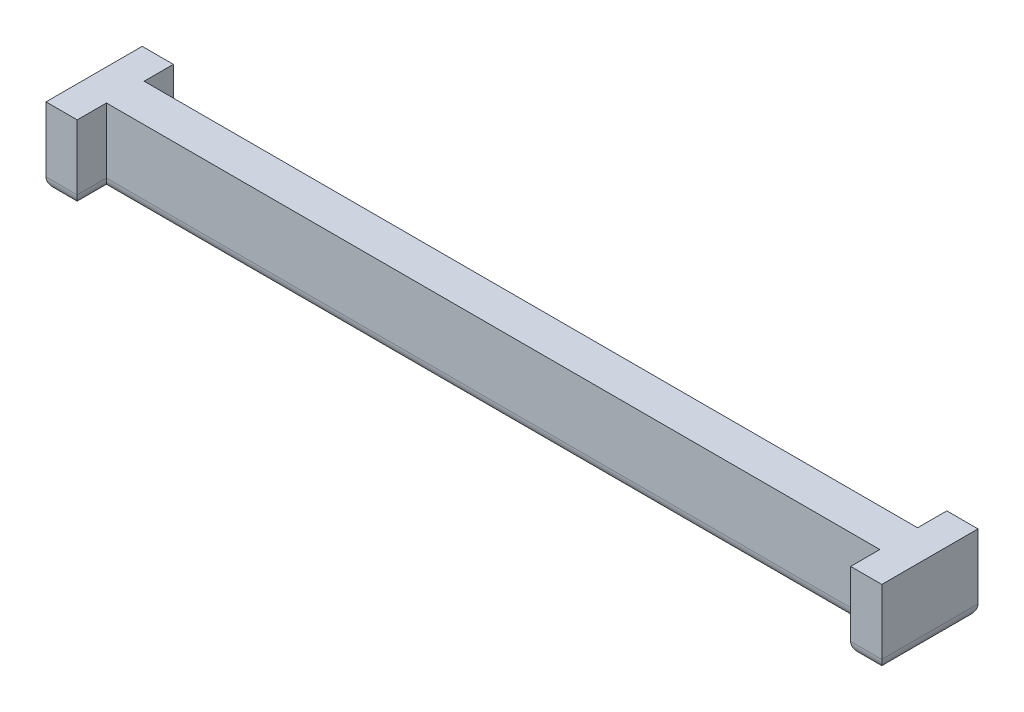
ISO-10303-21;
HEADER;
FILE_DESCRIPTION(('STEP AP214'),'2;1');
FILE_NAME('part.step','',(''),(''),'','','');
FILE_SCHEMA(('AUTOMOTIVE_DESIGN { 1 0 10303 214 1 1 1 1 }'));
ENDSEC;
DATA;
#1=APPLICATION_CONTEXT('core data for automotive mechanical design processes');
#2=APPLICATION_PROTOCOL_DEFINITION('international standard','automotive_design',2000,#1);
#3=PRODUCT_CONTEXT('',#1,'mechanical');
#4=PRODUCT('Part','Part','',(#3));
#5=PRODUCT_RELATED_PRODUCT_CATEGORY('part','',(#4));
#6=PRODUCT_DEFINITION_FORMATION('','',#4);
#7=PRODUCT_DEFINITION_CONTEXT('part definition',#1,'design');
#8=PRODUCT_DEFINITION('design','',#6,#7);
#9=PRODUCT_DEFINITION_SHAPE('','',#8);
#10=(LENGTH_UNIT() NAMED_UNIT(*) SI_UNIT(.MILLI.,.METRE.));
#11=(NAMED_UNIT(*) PLANE_ANGLE_UNIT() SI_UNIT($,.RADIAN.));
#12=(NAMED_UNIT(*) SI_UNIT($,.STERADIAN.) SOLID_ANGLE_UNIT());
#13=UNCERTAINTY_MEASURE_WITH_UNIT(LENGTH_MEASURE(1.E-05),#10,'distance_accuracy_value','');
#14=(GEOMETRIC_REPRESENTATION_CONTEXT(3) GLOBAL_UNCERTAINTY_ASSIGNED_CONTEXT((#13)) GLOBAL_UNIT_ASSIGNED_CONTEXT((#10,
#11,#12)) REPRESENTATION_CONTEXT('',''));
#15=CARTESIAN_POINT('',(0.,0.,0.));
#16=DIRECTION('',(0.,0.,1.));
#17=DIRECTION('',(1.,0.,0.));
#18=AXIS2_PLACEMENT_3D('',#15,#16,#17);
#19=CARTESIAN_POINT('',(-29.75,6.,-5.15));
#20=DIRECTION('',(-1.,0.,0.));
#21=DIRECTION('',(0.,0.,1.));
#22=AXIS2_PLACEMENT_3D('',#19,#20,#21);
#23=PLANE('',#22);
#24=DIRECTION('',(0.,-1.,0.));
#25=VECTOR('',#24,1.);
#26=CARTESIAN_POINT('',(-29.75,6.,-2.9));
#27=LINE('',#26,#25);
#28=CARTESIAN_POINT('',(-29.75,6.,-2.9));
#29=VERTEX_POINT('',#28);
#30=CARTESIAN_POINT('',(-29.75,1.,-2.9));
#31=VERTEX_POINT('',#30);
#32=EDGE_CURVE('E330',#29,#31,#27,.T.);
#33=ORIENTED_EDGE('',*,*,#32,.T.);
#34=DIRECTION('',(0.,0.,-1.));
#35=VECTOR('',#34,1.);
#36=CARTESIAN_POINT('',(-29.75,1.,-5.15));
#37=LINE('',#36,#35);
#38=CARTESIAN_POINT('',(-29.75,1.,-5.15));
#39=VERTEX_POINT('',#38);
#40=EDGE_CURVE('E11',#31,#39,#37,.T.);
#41=ORIENTED_EDGE('',*,*,#40,.T.);
#42=DIRECTION('',(0.,-1.,0.));
#43=VECTOR('',#42,1.);
#44=CARTESIAN_POINT('',(-29.75,6.,-5.15));
#45=LINE('',#44,#43);
#46=CARTESIAN_POINT('',(-29.75,6.,-5.15));
#47=VERTEX_POINT('',#46);
#48=EDGE_CURVE('E172',#47,#39,#45,.T.);
#49=ORIENTED_EDGE('',*,*,#48,.F.);
#50=DIRECTION('',(0.,0.,-1.));
#51=VECTOR('',#50,1.);
#52=CARTESIAN_POINT('',(-29.75,6.,-5.15));
#53=LINE('',#52,#51);
#54=EDGE_CURVE('E179',#29,#47,#53,.T.);
#55=ORIENTED_EDGE('',*,*,#54,.F.);
#56=EDGE_LOOP('',(#33,#41,#49,#55));
#57=FACE_BOUND('',#56,.T.);
#58=ADVANCED_FACE('F39',(#57),#23,.F.);
#59=CARTESIAN_POINT('',(-32.15,6.,-5.15));
#60=DIRECTION('',(0.,0.,1.));
#61=DIRECTION('',(1.,0.,0.));
#62=AXIS2_PLACEMENT_3D('',#59,#60,#61);
#63=PLANE('',#62);
#64=ORIENTED_EDGE('',*,*,#48,.T.);
#65=DIRECTION('',(-1.,0.,0.));
#66=VECTOR('',#65,1.);
#67=CARTESIAN_POINT('',(-32.15,1.,-5.15));
#68=LINE('',#67,#66);
#69=CARTESIAN_POINT('',(-32.15,1.,-5.15));
#70=VERTEX_POINT('',#69);
#71=EDGE_CURVE('E188',#39,#70,#68,.T.);
#72=ORIENTED_EDGE('',*,*,#71,.T.);
#73=DIRECTION('',(0.,-1.,0.));
#74=VECTOR('',#73,1.);
#75=CARTESIAN_POINT('',(-32.15,6.,-5.15));
#76=LINE('',#75,#74);
#77=CARTESIAN_POINT('',(-32.15,6.,-5.15));
#78=VERTEX_POINT('',#77);
#79=EDGE_CURVE('E175',#78,#70,#76,.T.);
#80=ORIENTED_EDGE('',*,*,#79,.F.);
#81=DIRECTION('',(-1.,0.,0.));
#82=VECTOR('',#81,1.);
#83=CARTESIAN_POINT('',(-32.15,6.,-5.15));
#84=LINE('',#83,#82);
#85=EDGE_CURVE('E167',#47,#78,#84,.T.);
#86=ORIENTED_EDGE('',*,*,#85,.F.);
#87=EDGE_LOOP('',(#64,#72,#80,#86));
#88=FACE_BOUND('',#87,.T.);
#89=ADVANCED_FACE('F169',(#88),#63,.F.);
#90=CARTESIAN_POINT('',(-32.15,6.,2.25));
#91=DIRECTION('',(1.,0.,0.));
#92=DIRECTION('',(0.,0.,-1.));
#93=AXIS2_PLACEMENT_3D('',#90,#91,#92);
#94=PLANE('',#93);
#95=ORIENTED_EDGE('',*,*,#79,.T.);
#96=DIRECTION('',(0.,0.,1.));
#97=VECTOR('',#96,1.);
#98=CARTESIAN_POINT('',(-32.15,1.,2.25));
#99=LINE('',#98,#97);
#100=CARTESIAN_POINT('',(-32.15,1.,2.25));
#101=VERTEX_POINT('',#100);
#102=EDGE_CURVE('E220',#70,#101,#99,.T.);
#103=ORIENTED_EDGE('',*,*,#102,.T.);
#104=DIRECTION('',(0.,-1.,0.));
#105=VECTOR('',#104,1.);
#106=CARTESIAN_POINT('',(-32.15,6.,2.25));
#107=LINE('',#106,#105);
#108=CARTESIAN_POINT('',(-32.15,6.,2.25));
#109=VERTEX_POINT('',#108);
#110=EDGE_CURVE('E192',#109,#101,#107,.T.);
#111=ORIENTED_EDGE('',*,*,#110,.F.);
#112=DIRECTION('',(0.,0.,1.));
#113=VECTOR('',#112,1.);
#114=CARTESIAN_POINT('',(-32.15,6.,2.25));
#115=LINE('',#114,#113);
#116=EDGE_CURVE('E178',#78,#109,#115,.T.);
#117=ORIENTED_EDGE('',*,*,#116,.F.);
#118=EDGE_LOOP('',(#95,#103,#111,#117));
#119=FACE_BOUND('',#118,.T.);
#120=ADVANCED_FACE('F307',(#119),#94,.F.);
#121=CARTESIAN_POINT('',(-29.75,6.,2.25));
#122=DIRECTION('',(0.,0.,-1.));
#123=DIRECTION('',(-1.,0.,0.));
#124=AXIS2_PLACEMENT_3D('',#121,#122,#123);
#125=PLANE('',#124);
#126=ORIENTED_EDGE('',*,*,#110,.T.);
#127=DIRECTION('',(1.,0.,0.));
#128=VECTOR('',#127,1.);
#129=CARTESIAN_POINT('',(-29.75,1.,2.25));
#130=LINE('',#129,#128);
#131=CARTESIAN_POINT('',(-29.75,1.,2.25));
#132=VERTEX_POINT('',#131);
#133=EDGE_CURVE('E222',#101,#132,#130,.T.);
#134=ORIENTED_EDGE('',*,*,#133,.T.);
#135=DIRECTION('',(0.,-1.,0.));
#136=VECTOR('',#135,1.);
#137=CARTESIAN_POINT('',(-29.75,6.,2.25));
#138=LINE('',#137,#136);
#139=CARTESIAN_POINT('',(-29.75,6.,2.25));
#140=VERTEX_POINT('',#139);
#141=EDGE_CURVE('E351',#140,#132,#138,.T.);
#142=ORIENTED_EDGE('',*,*,#141,.F.);
#143=DIRECTION('',(1.,0.,0.));
#144=VECTOR('',#143,1.);
#145=CARTESIAN_POINT('',(-29.75,6.,2.25));
#146=LINE('',#145,#144);
#147=EDGE_CURVE('E311',#109,#140,#146,.T.);
#148=ORIENTED_EDGE('',*,*,#147,.F.);
#149=EDGE_LOOP('',(#126,#134,#142,#148));
#150=FACE_BOUND('',#149,.T.);
#151=ADVANCED_FACE('F355',(#150),#125,.F.);
#152=CARTESIAN_POINT('',(-29.75,6.,0.));
#153=DIRECTION('',(-1.,0.,0.));
#154=DIRECTION('',(0.,0.,1.));
#155=AXIS2_PLACEMENT_3D('',#152,#153,#154);
#156=PLANE('',#155);
#157=ORIENTED_EDGE('',*,*,#141,.T.);
#158=DIRECTION('',(0.,0.,-1.));
#159=VECTOR('',#158,1.);
#160=CARTESIAN_POINT('',(-29.75,1.,0.));
#161=LINE('',#160,#159);
#162=CARTESIAN_POINT('',(-29.75,1.,0.));
#163=VERTEX_POINT('',#162);
#164=EDGE_CURVE('E224',#132,#163,#161,.T.);
#165=ORIENTED_EDGE('',*,*,#164,.T.);
#166=DIRECTION('',(0.,-1.,0.));
#167=VECTOR('',#166,1.);
#168=CARTESIAN_POINT('',(-29.75,6.,0.));
#169=LINE('',#168,#167);
#170=CARTESIAN_POINT('',(-29.75,6.,0.));
#171=VERTEX_POINT('',#170);
#172=EDGE_CURVE('E348',#171,#163,#169,.T.);
#173=ORIENTED_EDGE('',*,*,#172,.F.);
#174=DIRECTION('',(0.,0.,-1.));
#175=VECTOR('',#174,1.);
#176=CARTESIAN_POINT('',(-29.75,6.,0.));
#177=LINE('',#176,#175);
#178=EDGE_CURVE('E313',#140,#171,#177,.T.);
#179=ORIENTED_EDGE('',*,*,#178,.F.);
#180=EDGE_LOOP('',(#157,#165,#173,#179));
#181=FACE_BOUND('',#180,.T.);
#182=ADVANCED_FACE('F373',(#181),#156,.F.);
#183=CARTESIAN_POINT('',(29.75,6.,0.));
#184=DIRECTION('',(0.,0.,-1.));
#185=DIRECTION('',(-1.,0.,0.));
#186=AXIS2_PLACEMENT_3D('',#183,#184,#185);
#187=PLANE('',#186);
#188=ORIENTED_EDGE('',*,*,#172,.T.);
#189=DIRECTION('',(1.,0.,0.));
#190=VECTOR('',#189,1.);
#191=CARTESIAN_POINT('',(29.75,1.,0.));
#192=LINE('',#191,#190);
#193=CARTESIAN_POINT('',(29.75,1.,0.));
#194=VERTEX_POINT('',#193);
#195=EDGE_CURVE('E226',#163,#194,#192,.T.);
#196=ORIENTED_EDGE('',*,*,#195,.T.);
#197=DIRECTION('',(0.,-1.,0.));
#198=VECTOR('',#197,1.);
#199=CARTESIAN_POINT('',(29.75,6.,0.));
#200=LINE('',#199,#198);
#201=CARTESIAN_POINT('',(29.75,6.,0.));
#202=VERTEX_POINT('',#201);
#203=EDGE_CURVE('E345',#202,#194,#200,.T.);
#204=ORIENTED_EDGE('',*,*,#203,.F.);
#205=DIRECTION('',(1.,0.,0.));
#206=VECTOR('',#205,1.);
#207=CARTESIAN_POINT('',(29.75,6.,0.));
#208=LINE('',#207,#206);
#209=EDGE_CURVE('E317',#171,#202,#208,.T.);
#210=ORIENTED_EDGE('',*,*,#209,.F.);
#211=EDGE_LOOP('',(#188,#196,#204,#210));
#212=FACE_BOUND('',#211,.T.);
#213=ADVANCED_FACE('F378',(#212),#187,.F.);
#214=CARTESIAN_POINT('',(29.75,6.,2.25));
#215=DIRECTION('',(1.,0.,0.));
#216=DIRECTION('',(0.,0.,-1.));
#217=AXIS2_PLACEMENT_3D('',#214,#215,#216);
#218=PLANE('',#217);
#219=ORIENTED_EDGE('',*,*,#203,.T.);
#220=DIRECTION('',(0.,0.,1.));
#221=VECTOR('',#220,1.);
#222=CARTESIAN_POINT('',(29.75,1.,2.25));
#223=LINE('',#222,#221);
#224=CARTESIAN_POINT('',(29.75,1.,2.25));
#225=VERTEX_POINT('',#224);
#226=EDGE_CURVE('E228',#194,#225,#223,.T.);
#227=ORIENTED_EDGE('',*,*,#226,.T.);
#228=DIRECTION('',(0.,-1.,0.));
#229=VECTOR('',#228,1.);
#230=CARTESIAN_POINT('',(29.75,6.,2.25));
#231=LINE('',#230,#229);
#232=CARTESIAN_POINT('',(29.75,6.,2.25));
#233=VERTEX_POINT('',#232);
#234=EDGE_CURVE('E342',#233,#225,#231,.T.);
#235=ORIENTED_EDGE('',*,*,#234,.F.);
#236=DIRECTION('',(0.,0.,1.));
#237=VECTOR('',#236,1.);
#238=CARTESIAN_POINT('',(29.75,6.,2.25));
#239=LINE('',#238,#237);
#240=EDGE_CURVE('E319',#202,#233,#239,.T.);
#241=ORIENTED_EDGE('',*,*,#240,.F.);
#242=EDGE_LOOP('',(#219,#227,#235,#241));
#243=FACE_BOUND('',#242,.T.);
#244=ADVANCED_FACE('F385',(#243),#218,.F.);
#245=CARTESIAN_POINT('',(32.15,6.,2.25));
#246=DIRECTION('',(0.,0.,-1.));
#247=DIRECTION('',(-1.,0.,0.));
#248=AXIS2_PLACEMENT_3D('',#245,#246,#247);
#249=PLANE('',#248);
#250=ORIENTED_EDGE('',*,*,#234,.T.);
#251=DIRECTION('',(1.,0.,0.));
#252=VECTOR('',#251,1.);
#253=CARTESIAN_POINT('',(32.15,1.,2.25));
#254=LINE('',#253,#252);
#255=CARTESIAN_POINT('',(32.15,1.,2.25));
#256=VERTEX_POINT('',#255);
#257=EDGE_CURVE('E230',#225,#256,#254,.T.);
#258=ORIENTED_EDGE('',*,*,#257,.T.);
#259=DIRECTION('',(0.,-1.,0.));
#260=VECTOR('',#259,1.);
#261=CARTESIAN_POINT('',(32.15,6.,2.25));
#262=LINE('',#261,#260);
#263=CARTESIAN_POINT('',(32.15,6.,2.25));
#264=VERTEX_POINT('',#263);
#265=EDGE_CURVE('E339',#264,#256,#262,.T.);
#266=ORIENTED_EDGE('',*,*,#265,.F.);
#267=DIRECTION('',(1.,0.,0.));
#268=VECTOR('',#267,1.);
#269=CARTESIAN_POINT('',(32.15,6.,2.25));
#270=LINE('',#269,#268);
#271=EDGE_CURVE('E321',#233,#264,#270,.T.);
#272=ORIENTED_EDGE('',*,*,#271,.F.);
#273=EDGE_LOOP('',(#250,#258,#266,#272));
#274=FACE_BOUND('',#273,.T.);
#275=ADVANCED_FACE('F389',(#274),#249,.F.);
#276=CARTESIAN_POINT('',(32.15,6.,-5.15));
#277=DIRECTION('',(-1.,0.,0.));
#278=DIRECTION('',(0.,0.,1.));
#279=AXIS2_PLACEMENT_3D('',#276,#277,#278);
#280=PLANE('',#279);
#281=ORIENTED_EDGE('',*,*,#265,.T.);
#282=DIRECTION('',(0.,0.,-1.));
#283=VECTOR('',#282,1.);
#284=CARTESIAN_POINT('',(32.15,1.,-5.15));
#285=LINE('',#284,#283);
#286=CARTESIAN_POINT('',(32.15,1.,-5.15));
#287=VERTEX_POINT('',#286);
#288=EDGE_CURVE('E232',#256,#287,#285,.T.);
#289=ORIENTED_EDGE('',*,*,#288,.T.);
#290=DIRECTION('',(0.,-1.,0.));
#291=VECTOR('',#290,1.);
#292=CARTESIAN_POINT('',(32.15,6.,-5.15));
#293=LINE('',#292,#291);
#294=CARTESIAN_POINT('',(32.15,6.,-5.15));
#295=VERTEX_POINT('',#294);
#296=EDGE_CURVE('E336',#295,#287,#293,.T.);
#297=ORIENTED_EDGE('',*,*,#296,.F.);
#298=DIRECTION('',(0.,0.,-1.));
#299=VECTOR('',#298,1.);
#300=CARTESIAN_POINT('',(32.15,6.,-5.15));
#301=LINE('',#300,#299);
#302=EDGE_CURVE('E323',#264,#295,#301,.T.);
#303=ORIENTED_EDGE('',*,*,#302,.F.);
#304=EDGE_LOOP('',(#281,#289,#297,#303));
#305=FACE_BOUND('',#304,.T.);
#306=ADVANCED_FACE('F396',(#305),#280,.F.);
#307=CARTESIAN_POINT('',(29.75,6.,-5.15));
#308=DIRECTION('',(0.,0.,1.));
#309=DIRECTION('',(1.,0.,0.));
#310=AXIS2_PLACEMENT_3D('',#307,#308,#309);
#311=PLANE('',#310);
#312=ORIENTED_EDGE('',*,*,#296,.T.);
#313=DIRECTION('',(-1.,0.,0.));
#314=VECTOR('',#313,1.);
#315=CARTESIAN_POINT('',(29.75,1.,-5.15));
#316=LINE('',#315,#314);
#317=CARTESIAN_POINT('',(29.75,1.,-5.15));
#318=VERTEX_POINT('',#317);
#319=EDGE_CURVE('E234',#287,#318,#316,.T.);
#320=ORIENTED_EDGE('',*,*,#319,.T.);
#321=DIRECTION('',(0.,-1.,0.));
#322=VECTOR('',#321,1.);
#323=CARTESIAN_POINT('',(29.75,6.,-5.15));
#324=LINE('',#323,#322);
#325=CARTESIAN_POINT('',(29.75,6.,-5.15));
#326=VERTEX_POINT('',#325);
#327=EDGE_CURVE('E334',#326,#318,#324,.T.);
#328=ORIENTED_EDGE('',*,*,#327,.F.);
#329=DIRECTION('',(-1.,0.,0.));
#330=VECTOR('',#329,1.);
#331=CARTESIAN_POINT('',(29.75,6.,-5.15));
#332=LINE('',#331,#330);
#333=EDGE_CURVE('E325',#295,#326,#332,.T.);
#334=ORIENTED_EDGE('',*,*,#333,.F.);
#335=EDGE_LOOP('',(#312,#320,#328,#334));
#336=FACE_BOUND('',#335,.T.);
#337=ADVANCED_FACE('F398',(#336),#311,.F.);
#338=CARTESIAN_POINT('',(29.75,6.,-2.9));
#339=DIRECTION('',(1.,0.,0.));
#340=DIRECTION('',(0.,0.,-1.));
#341=AXIS2_PLACEMENT_3D('',#338,#339,#340);
#342=PLANE('',#341);
#343=ORIENTED_EDGE('',*,*,#327,.T.);
#344=DIRECTION('',(0.,0.,1.));
#345=VECTOR('',#344,1.);
#346=CARTESIAN_POINT('',(29.75,1.,-2.9));
#347=LINE('',#346,#345);
#348=CARTESIAN_POINT('',(29.75,1.,-2.9));
#349=VERTEX_POINT('',#348);
#350=EDGE_CURVE('E63',#318,#349,#347,.T.);
#351=ORIENTED_EDGE('',*,*,#350,.T.);
#352=DIRECTION('',(0.,-1.,0.));
#353=VECTOR('',#352,1.);
#354=CARTESIAN_POINT('',(29.75,6.,-2.9));
#355=LINE('',#354,#353);
#356=CARTESIAN_POINT('',(29.75,6.,-2.9));
#357=VERTEX_POINT('',#356);
#358=EDGE_CURVE('E332',#357,#349,#355,.T.);
#359=ORIENTED_EDGE('',*,*,#358,.F.);
#360=DIRECTION('',(0.,0.,1.));
#361=VECTOR('',#360,1.);
#362=CARTESIAN_POINT('',(29.75,6.,-2.9));
#363=LINE('',#362,#361);
#364=EDGE_CURVE('E327',#326,#357,#363,.T.);
#365=ORIENTED_EDGE('',*,*,#364,.F.);
#366=EDGE_LOOP('',(#343,#351,#359,#365));
#367=FACE_BOUND('',#366,.T.);
#368=ADVANCED_FACE('F400',(#367),#342,.F.);
#369=CARTESIAN_POINT('',(-29.75,6.,-2.9));
#370=DIRECTION('',(0.,0.,1.));
#371=DIRECTION('',(1.,0.,0.));
#372=AXIS2_PLACEMENT_3D('',#369,#370,#371);
#373=PLANE('',#372);
#374=ORIENTED_EDGE('',*,*,#358,.T.);
#375=DIRECTION('',(-1.,0.,0.));
#376=VECTOR('',#375,1.);
#377=CARTESIAN_POINT('',(-29.75,1.,-2.9));
#378=LINE('',#377,#376);
#379=EDGE_CURVE('E48',#349,#31,#378,.T.);
#380=ORIENTED_EDGE('',*,*,#379,.T.);
#381=ORIENTED_EDGE('',*,*,#32,.F.);
#382=DIRECTION('',(-1.,0.,0.));
#383=VECTOR('',#382,1.);
#384=CARTESIAN_POINT('',(-29.75,6.,-2.9));
#385=LINE('',#384,#383);
#386=EDGE_CURVE('E184',#357,#29,#385,.T.);
#387=ORIENTED_EDGE('',*,*,#386,.F.);
#388=EDGE_LOOP('',(#374,#380,#381,#387));
#389=FACE_BOUND('',#388,.T.);
#390=ADVANCED_FACE('F401',(#389),#373,.F.);
#391=CARTESIAN_POINT('',(0.,6.,0.));
#392=DIRECTION('',(0.,1.,0.));
#393=DIRECTION('',(0.,0.,1.));
#394=AXIS2_PLACEMENT_3D('',#391,#392,#393);
#395=PLANE('',#394);
#396=ORIENTED_EDGE('',*,*,#54,.T.);
#397=ORIENTED_EDGE('',*,*,#85,.T.);
#398=ORIENTED_EDGE('',*,*,#116,.T.);
#399=ORIENTED_EDGE('',*,*,#147,.T.);
#400=ORIENTED_EDGE('',*,*,#178,.T.);
#401=ORIENTED_EDGE('',*,*,#209,.T.);
#402=ORIENTED_EDGE('',*,*,#240,.T.);
#403=ORIENTED_EDGE('',*,*,#271,.T.);
#404=ORIENTED_EDGE('',*,*,#302,.T.);
#405=ORIENTED_EDGE('',*,*,#333,.T.);
#406=ORIENTED_EDGE('',*,*,#364,.T.);
#407=ORIENTED_EDGE('',*,*,#386,.T.);
#408=EDGE_LOOP('',(#396,#397,#398,#399,#400,#401,#402,#403,#404,#405,#406,#407));
#409=FACE_BOUND('',#408,.T.);
#410=ADVANCED_FACE('F182',(#409),#395,.T.);
#411=CARTESIAN_POINT('',(0.,0.,0.));
#412=DIRECTION('',(0.,1.,0.));
#413=DIRECTION('',(0.,0.,1.));
#414=AXIS2_PLACEMENT_3D('',#411,#412,#413);
#415=PLANE('',#414);
#416=DIRECTION('',(0.,0.,1.));
#417=VECTOR('',#416,1.);
#418=CARTESIAN_POINT('',(-31.15,0.,0.));
#419=LINE('',#418,#417);
#420=CARTESIAN_POINT('',(-31.15,0.,1.25));
#421=VERTEX_POINT('',#420);
#422=CARTESIAN_POINT('',(-31.15,0.,-4.15));
#423=VERTEX_POINT('',#422);
#424=EDGE_CURVE('E215',#421,#423,#419,.F.);
#425=ORIENTED_EDGE('',*,*,#424,.T.);
#426=DIRECTION('',(-1.,0.,0.));
#427=VECTOR('',#426,1.);
#428=CARTESIAN_POINT('',(0.,0.,-4.15));
#429=LINE('',#428,#427);
#430=CARTESIAN_POINT('',(-30.75,0.,-4.15));
#431=VERTEX_POINT('',#430);
#432=EDGE_CURVE('E217',#423,#431,#429,.F.);
#433=ORIENTED_EDGE('',*,*,#432,.T.);
#434=DIRECTION('',(0.,0.,-1.));
#435=VECTOR('',#434,1.);
#436=CARTESIAN_POINT('',(-30.75,0.,0.));
#437=LINE('',#436,#435);
#438=CARTESIAN_POINT('',(-30.75,0.,-1.9));
#439=VERTEX_POINT('',#438);
#440=EDGE_CURVE('E190',#431,#439,#437,.F.);
#441=ORIENTED_EDGE('',*,*,#440,.T.);
#442=DIRECTION('',(-1.,0.,0.));
#443=VECTOR('',#442,1.);
#444=CARTESIAN_POINT('',(0.,0.,-1.9));
#445=LINE('',#444,#443);
#446=CARTESIAN_POINT('',(30.75,0.,-1.9));
#447=VERTEX_POINT('',#446);
#448=EDGE_CURVE('E197',#439,#447,#445,.F.);
#449=ORIENTED_EDGE('',*,*,#448,.T.);
#450=DIRECTION('',(0.,0.,1.));
#451=VECTOR('',#450,1.);
#452=CARTESIAN_POINT('',(30.75,0.,0.));
#453=LINE('',#452,#451);
#454=CARTESIAN_POINT('',(30.75,0.,-4.15));
#455=VERTEX_POINT('',#454);
#456=EDGE_CURVE('E199',#447,#455,#453,.F.);
#457=ORIENTED_EDGE('',*,*,#456,.T.);
#458=DIRECTION('',(-1.,0.,0.));
#459=VECTOR('',#458,1.);
#460=CARTESIAN_POINT('',(0.,0.,-4.15));
#461=LINE('',#460,#459);
#462=CARTESIAN_POINT('',(31.15,0.,-4.15));
#463=VERTEX_POINT('',#462);
#464=EDGE_CURVE('E201',#455,#463,#461,.F.);
#465=ORIENTED_EDGE('',*,*,#464,.T.);
#466=DIRECTION('',(0.,0.,-1.));
#467=VECTOR('',#466,1.);
#468=CARTESIAN_POINT('',(31.15,0.,0.));
#469=LINE('',#468,#467);
#470=CARTESIAN_POINT('',(31.15,0.,1.25));
#471=VERTEX_POINT('',#470);
#472=EDGE_CURVE('E203',#463,#471,#469,.F.);
#473=ORIENTED_EDGE('',*,*,#472,.T.);
#474=DIRECTION('',(1.,0.,0.));
#475=VECTOR('',#474,1.);
#476=CARTESIAN_POINT('',(0.,0.,1.25));
#477=LINE('',#476,#475);
#478=CARTESIAN_POINT('',(30.75,0.,1.25));
#479=VERTEX_POINT('',#478);
#480=EDGE_CURVE('E205',#471,#479,#477,.F.);
#481=ORIENTED_EDGE('',*,*,#480,.T.);
#482=DIRECTION('',(0.,0.,1.));
#483=VECTOR('',#482,1.);
#484=CARTESIAN_POINT('',(30.75,0.,0.));
#485=LINE('',#484,#483);
#486=CARTESIAN_POINT('',(30.75,0.,-1.));
#487=VERTEX_POINT('',#486);
#488=EDGE_CURVE('E207',#479,#487,#485,.F.);
#489=ORIENTED_EDGE('',*,*,#488,.T.);
#490=DIRECTION('',(1.,0.,0.));
#491=VECTOR('',#490,1.);
#492=CARTESIAN_POINT('',(0.,0.,-1.));
#493=LINE('',#492,#491);
#494=CARTESIAN_POINT('',(-30.75,0.,-1.));
#495=VERTEX_POINT('',#494);
#496=EDGE_CURVE('E209',#487,#495,#493,.F.);
#497=ORIENTED_EDGE('',*,*,#496,.T.);
#498=DIRECTION('',(0.,0.,-1.));
#499=VECTOR('',#498,1.);
#500=CARTESIAN_POINT('',(-30.75,0.,0.));
#501=LINE('',#500,#499);
#502=CARTESIAN_POINT('',(-30.75,0.,1.25));
#503=VERTEX_POINT('',#502);
#504=EDGE_CURVE('E211',#495,#503,#501,.F.);
#505=ORIENTED_EDGE('',*,*,#504,.T.);
#506=DIRECTION('',(1.,0.,0.));
#507=VECTOR('',#506,1.);
#508=CARTESIAN_POINT('',(0.,0.,1.25));
#509=LINE('',#508,#507);
#510=EDGE_CURVE('E213',#503,#421,#509,.F.);
#511=ORIENTED_EDGE('',*,*,#510,.T.);
#512=EDGE_LOOP('',(#425,#433,#441,#449,#457,#465,#473,#481,#489,#497,#505,#511));
#513=FACE_BOUND('',#512,.T.);
#514=ADVANCED_FACE('F282',(#513),#415,.F.);
#515=CARTESIAN_POINT('',(32.15,1.,1.25));
#516=DIRECTION('',(1.,0.,0.));
#517=DIRECTION('',(0.,0.,-1.));
#518=AXIS2_PLACEMENT_3D('',#515,#516,#517);
#519=CYLINDRICAL_SURFACE('',#518,1.);
#520=CARTESIAN_POINT('',(30.75,1.,1.25));
#521=DIRECTION('',(0.707106781186547,0.,0.707106781186547));
#522=DIRECTION('',(0.707106781186547,0.,-0.707106781186547));
#523=AXIS2_PLACEMENT_3D('',#520,#521,#522);
#524=ELLIPSE('',#523,1.41421356237309,1.);
#525=EDGE_CURVE('E265',#479,#225,#524,.F.);
#526=ORIENTED_EDGE('',*,*,#525,.F.);
#527=ORIENTED_EDGE('',*,*,#480,.F.);
#528=CARTESIAN_POINT('',(31.15,1.,1.25));
#529=DIRECTION('',(0.707106781186547,0.,-0.707106781186547));
#530=DIRECTION('',(-0.707106781186547,0.,-0.707106781186547));
#531=AXIS2_PLACEMENT_3D('',#528,#529,#530);
#532=ELLIPSE('',#531,1.41421356237309,1.);
#533=EDGE_CURVE('E43',#256,#471,#532,.T.);
#534=ORIENTED_EDGE('',*,*,#533,.F.);
#535=ORIENTED_EDGE('',*,*,#257,.F.);
#536=EDGE_LOOP('',(#526,#527,#534,#535));
#537=FACE_BOUND('',#536,.T.);
#538=ADVANCED_FACE('F41',(#537),#519,.T.);
#539=CARTESIAN_POINT('',(31.15,1.,-5.15));
#540=DIRECTION('',(0.,0.,-1.));
#541=DIRECTION('',(-1.,0.,0.));
#542=AXIS2_PLACEMENT_3D('',#539,#540,#541);
#543=CYLINDRICAL_SURFACE('',#542,1.);
#544=ORIENTED_EDGE('',*,*,#533,.T.);
#545=ORIENTED_EDGE('',*,*,#472,.F.);
#546=CARTESIAN_POINT('',(31.15,1.,-4.15));
#547=DIRECTION('',(-0.707106781186547,0.,-0.707106781186547));
#548=DIRECTION('',(-0.707106781186547,0.,0.707106781186547));
#549=AXIS2_PLACEMENT_3D('',#546,#547,#548);
#550=ELLIPSE('',#549,1.41421356237309,1.);
#551=EDGE_CURVE('E263',#287,#463,#550,.T.);
#552=ORIENTED_EDGE('',*,*,#551,.F.);
#553=ORIENTED_EDGE('',*,*,#288,.F.);
#554=EDGE_LOOP('',(#544,#545,#552,#553));
#555=FACE_BOUND('',#554,.T.);
#556=ADVANCED_FACE('F276',(#555),#543,.T.);
#557=CARTESIAN_POINT('',(30.75,1.,2.25));
#558=DIRECTION('',(0.,0.,1.));
#559=DIRECTION('',(1.,0.,0.));
#560=AXIS2_PLACEMENT_3D('',#557,#558,#559);
#561=CYLINDRICAL_SURFACE('',#560,1.);
#562=ORIENTED_EDGE('',*,*,#525,.T.);
#563=ORIENTED_EDGE('',*,*,#226,.F.);
#564=CARTESIAN_POINT('',(30.75,1.,-1.));
#565=DIRECTION('',(0.707106781186547,0.,0.707106781186547));
#566=DIRECTION('',(0.707106781186547,0.,-0.707106781186547));
#567=AXIS2_PLACEMENT_3D('',#564,#565,#566);
#568=ELLIPSE('',#567,1.41421356237309,1.);
#569=EDGE_CURVE('E260',#487,#194,#568,.F.);
#570=ORIENTED_EDGE('',*,*,#569,.F.);
#571=ORIENTED_EDGE('',*,*,#488,.F.);
#572=EDGE_LOOP('',(#562,#563,#570,#571));
#573=FACE_BOUND('',#572,.T.);
#574=ADVANCED_FACE('F382',(#573),#561,.T.);
#575=CARTESIAN_POINT('',(29.75,1.,-4.15));
#576=DIRECTION('',(-1.,0.,0.));
#577=DIRECTION('',(0.,0.,1.));
#578=AXIS2_PLACEMENT_3D('',#575,#576,#577);
#579=CYLINDRICAL_SURFACE('',#578,1.);
#580=ORIENTED_EDGE('',*,*,#551,.T.);
#581=ORIENTED_EDGE('',*,*,#464,.F.);
#582=CARTESIAN_POINT('',(30.75,1.,-4.15));
#583=DIRECTION('',(-0.707106781186547,0.,0.707106781186547));
#584=DIRECTION('',(0.707106781186547,0.,0.707106781186547));
#585=AXIS2_PLACEMENT_3D('',#582,#583,#584);
#586=ELLIPSE('',#585,1.41421356237309,1.);
#587=EDGE_CURVE('E257',#318,#455,#586,.T.);
#588=ORIENTED_EDGE('',*,*,#587,.F.);
#589=ORIENTED_EDGE('',*,*,#319,.F.);
#590=EDGE_LOOP('',(#580,#581,#588,#589));
#591=FACE_BOUND('',#590,.T.);
#592=ADVANCED_FACE('F288',(#591),#579,.T.);
#593=CARTESIAN_POINT('',(29.75,1.,-1.));
#594=DIRECTION('',(1.,0.,0.));
#595=DIRECTION('',(0.,0.,-1.));
#596=AXIS2_PLACEMENT_3D('',#593,#594,#595);
#597=CYLINDRICAL_SURFACE('',#596,1.);
#598=ORIENTED_EDGE('',*,*,#569,.T.);
#599=ORIENTED_EDGE('',*,*,#195,.F.);
#600=CARTESIAN_POINT('',(-30.75,1.,-1.));
#601=DIRECTION('',(0.707106781186547,0.,-0.707106781186547));
#602=DIRECTION('',(-0.707106781186547,0.,-0.707106781186547));
#603=AXIS2_PLACEMENT_3D('',#600,#601,#602);
#604=ELLIPSE('',#603,1.41421356237309,1.);
#605=EDGE_CURVE('E254',#495,#163,#604,.F.);
#606=ORIENTED_EDGE('',*,*,#605,.F.);
#607=ORIENTED_EDGE('',*,*,#496,.F.);
#608=EDGE_LOOP('',(#598,#599,#606,#607));
#609=FACE_BOUND('',#608,.T.);
#610=ADVANCED_FACE('F381',(#609),#597,.T.);
#611=CARTESIAN_POINT('',(30.75,1.,-2.9));
#612=DIRECTION('',(0.,0.,1.));
#613=DIRECTION('',(1.,0.,0.));
#614=AXIS2_PLACEMENT_3D('',#611,#612,#613);
#615=CYLINDRICAL_SURFACE('',#614,1.);
#616=ORIENTED_EDGE('',*,*,#587,.T.);
#617=ORIENTED_EDGE('',*,*,#456,.F.);
#618=CARTESIAN_POINT('',(30.75,1.,-1.9));
#619=DIRECTION('',(-0.707106781186547,0.,0.707106781186547));
#620=DIRECTION('',(0.707106781186547,0.,0.707106781186547));
#621=AXIS2_PLACEMENT_3D('',#618,#619,#620);
#622=ELLIPSE('',#621,1.41421356237309,1.);
#623=EDGE_CURVE('E251',#349,#447,#622,.T.);
#624=ORIENTED_EDGE('',*,*,#623,.F.);
#625=ORIENTED_EDGE('',*,*,#350,.F.);
#626=EDGE_LOOP('',(#616,#617,#624,#625));
#627=FACE_BOUND('',#626,.T.);
#628=ADVANCED_FACE('F291',(#627),#615,.T.);
#629=CARTESIAN_POINT('',(-30.75,1.,0.));
#630=DIRECTION('',(0.,0.,-1.));
#631=DIRECTION('',(-1.,0.,0.));
#632=AXIS2_PLACEMENT_3D('',#629,#630,#631);
#633=CYLINDRICAL_SURFACE('',#632,1.);
#634=ORIENTED_EDGE('',*,*,#605,.T.);
#635=ORIENTED_EDGE('',*,*,#164,.F.);
#636=CARTESIAN_POINT('',(-30.75,1.,1.25));
#637=DIRECTION('',(0.707106781186547,0.,-0.707106781186547));
#638=DIRECTION('',(-0.707106781186547,0.,-0.707106781186547));
#639=AXIS2_PLACEMENT_3D('',#636,#637,#638);
#640=ELLIPSE('',#639,1.41421356237309,1.);
#641=EDGE_CURVE('E248',#503,#132,#640,.F.);
#642=ORIENTED_EDGE('',*,*,#641,.F.);
#643=ORIENTED_EDGE('',*,*,#504,.F.);
#644=EDGE_LOOP('',(#634,#635,#642,#643));
#645=FACE_BOUND('',#644,.T.);
#646=ADVANCED_FACE('F370',(#645),#633,.T.);
#647=CARTESIAN_POINT('',(-29.75,1.,-1.9));
#648=DIRECTION('',(-1.,0.,0.));
#649=DIRECTION('',(0.,0.,1.));
#650=AXIS2_PLACEMENT_3D('',#647,#648,#649);
#651=CYLINDRICAL_SURFACE('',#650,1.);
#652=ORIENTED_EDGE('',*,*,#623,.T.);
#653=ORIENTED_EDGE('',*,*,#448,.F.);
#654=CARTESIAN_POINT('',(-30.75,1.,-1.9));
#655=DIRECTION('',(-0.707106781186547,0.,-0.707106781186547));
#656=DIRECTION('',(-0.707106781186547,0.,0.707106781186547));
#657=AXIS2_PLACEMENT_3D('',#654,#655,#656);
#658=ELLIPSE('',#657,1.41421356237309,1.);
#659=EDGE_CURVE('E245',#31,#439,#658,.T.);
#660=ORIENTED_EDGE('',*,*,#659,.F.);
#661=ORIENTED_EDGE('',*,*,#379,.F.);
#662=EDGE_LOOP('',(#652,#653,#660,#661));
#663=FACE_BOUND('',#662,.T.);
#664=ADVANCED_FACE('F296',(#663),#651,.T.);
#665=CARTESIAN_POINT('',(-29.75,1.,1.25));
#666=DIRECTION('',(1.,0.,0.));
#667=DIRECTION('',(0.,0.,-1.));
#668=AXIS2_PLACEMENT_3D('',#665,#666,#667);
#669=CYLINDRICAL_SURFACE('',#668,1.);
#670=ORIENTED_EDGE('',*,*,#641,.T.);
#671=ORIENTED_EDGE('',*,*,#133,.F.);
#672=CARTESIAN_POINT('',(-31.15,1.,1.25));
#673=DIRECTION('',(0.707106781186547,0.,0.707106781186547));
#674=DIRECTION('',(0.707106781186547,0.,-0.707106781186547));
#675=AXIS2_PLACEMENT_3D('',#672,#673,#674);
#676=ELLIPSE('',#675,1.41421356237309,1.);
#677=EDGE_CURVE('E242',#421,#101,#676,.F.);
#678=ORIENTED_EDGE('',*,*,#677,.F.);
#679=ORIENTED_EDGE('',*,*,#510,.F.);
#680=EDGE_LOOP('',(#670,#671,#678,#679));
#681=FACE_BOUND('',#680,.T.);
#682=ADVANCED_FACE('F359',(#681),#669,.T.);
#683=CARTESIAN_POINT('',(-30.75,1.,-5.15));
#684=DIRECTION('',(0.,0.,-1.));
#685=DIRECTION('',(-1.,0.,0.));
#686=AXIS2_PLACEMENT_3D('',#683,#684,#685);
#687=CYLINDRICAL_SURFACE('',#686,1.);
#688=ORIENTED_EDGE('',*,*,#659,.T.);
#689=ORIENTED_EDGE('',*,*,#440,.F.);
#690=CARTESIAN_POINT('',(-30.75,1.,-4.15));
#691=DIRECTION('',(-0.707106781186547,0.,-0.707106781186547));
#692=DIRECTION('',(0.707106781186547,0.,-0.707106781186547));
#693=AXIS2_PLACEMENT_3D('',#690,#691,#692);
#694=ELLIPSE('',#693,1.41421356237309,1.);
#695=EDGE_CURVE('E240',#39,#431,#694,.T.);
#696=ORIENTED_EDGE('',*,*,#695,.F.);
#697=ORIENTED_EDGE('',*,*,#40,.F.);
#698=EDGE_LOOP('',(#688,#689,#696,#697));
#699=FACE_BOUND('',#698,.T.);
#700=ADVANCED_FACE('F299',(#699),#687,.T.);
#701=CARTESIAN_POINT('',(-31.15,1.,2.25));
#702=DIRECTION('',(0.,0.,1.));
#703=DIRECTION('',(1.,0.,0.));
#704=AXIS2_PLACEMENT_3D('',#701,#702,#703);
#705=CYLINDRICAL_SURFACE('',#704,1.);
#706=ORIENTED_EDGE('',*,*,#677,.T.);
#707=ORIENTED_EDGE('',*,*,#102,.F.);
#708=CARTESIAN_POINT('',(-31.15,1.,-4.15));
#709=DIRECTION('',(-0.707106781186547,0.,0.707106781186547));
#710=DIRECTION('',(0.707106781186547,0.,0.707106781186547));
#711=AXIS2_PLACEMENT_3D('',#708,#709,#710);
#712=ELLIPSE('',#711,1.41421356237309,1.);
#713=EDGE_CURVE('E238',#423,#70,#712,.F.);
#714=ORIENTED_EDGE('',*,*,#713,.F.);
#715=ORIENTED_EDGE('',*,*,#424,.F.);
#716=EDGE_LOOP('',(#706,#707,#714,#715));
#717=FACE_BOUND('',#716,.T.);
#718=ADVANCED_FACE('F364',(#717),#705,.T.);
#719=CARTESIAN_POINT('',(-32.15,1.,-4.15));
#720=DIRECTION('',(-1.,0.,0.));
#721=DIRECTION('',(0.,0.,1.));
#722=AXIS2_PLACEMENT_3D('',#719,#720,#721);
#723=CYLINDRICAL_SURFACE('',#722,1.);
#724=ORIENTED_EDGE('',*,*,#695,.T.);
#725=ORIENTED_EDGE('',*,*,#432,.F.);
#726=ORIENTED_EDGE('',*,*,#713,.T.);
#727=ORIENTED_EDGE('',*,*,#71,.F.);
#728=EDGE_LOOP('',(#724,#725,#726,#727));
#729=FACE_BOUND('',#728,.T.);
#730=ADVANCED_FACE('F303',(#729),#723,.T.);
#731=CLOSED_SHELL('',(#58,#89,#120,#151,#182,#213,#244,#275,#306,#337,#368,#390,#410,#514,#538,
#556,#574,#592,#610,#628,#646,#664,#682,#700,#718,#730));
#732=MANIFOLD_SOLID_BREP('B2',#731);
#733=ADVANCED_BREP_SHAPE_REPRESENTATION('',(#18,#732),#14);
#734=SHAPE_DEFINITION_REPRESENTATION(#9,#733);
ENDSEC;
END-ISO-10303-21;
